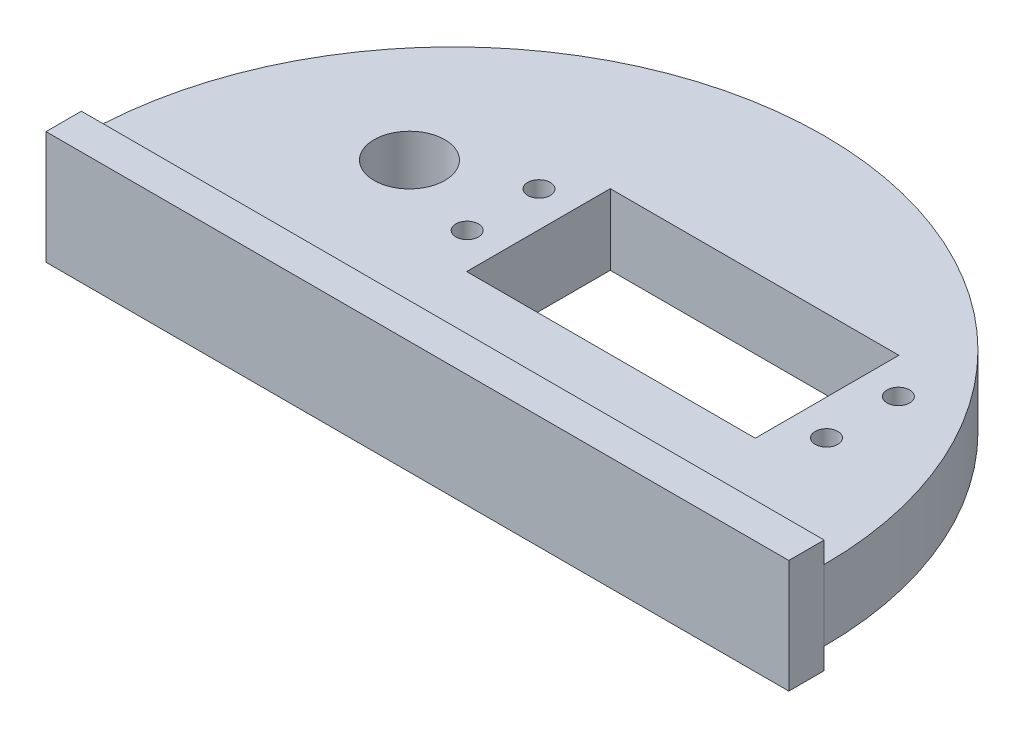
ISO-10303-21;
HEADER;
FILE_DESCRIPTION(('STEP AP214'),'2;1');
FILE_NAME('part.step','',(''),(''),'','','');
FILE_SCHEMA(('AUTOMOTIVE_DESIGN { 1 0 10303 214 1 1 1 1 }'));
ENDSEC;
DATA;
#1=APPLICATION_CONTEXT('core data for automotive mechanical design processes');
#2=APPLICATION_PROTOCOL_DEFINITION('international standard','automotive_design',2000,#1);
#3=PRODUCT_CONTEXT('',#1,'mechanical');
#4=PRODUCT('Part','Part','',(#3));
#5=PRODUCT_RELATED_PRODUCT_CATEGORY('part','',(#4));
#6=PRODUCT_DEFINITION_FORMATION('','',#4);
#7=PRODUCT_DEFINITION_CONTEXT('part definition',#1,'design');
#8=PRODUCT_DEFINITION('design','',#6,#7);
#9=PRODUCT_DEFINITION_SHAPE('','',#8);
#10=(LENGTH_UNIT() NAMED_UNIT(*) SI_UNIT(.MILLI.,.METRE.));
#11=(NAMED_UNIT(*) PLANE_ANGLE_UNIT() SI_UNIT($,.RADIAN.));
#12=(NAMED_UNIT(*) SI_UNIT($,.STERADIAN.) SOLID_ANGLE_UNIT());
#13=UNCERTAINTY_MEASURE_WITH_UNIT(LENGTH_MEASURE(1.E-05),#10,'distance_accuracy_value','');
#14=(GEOMETRIC_REPRESENTATION_CONTEXT(3) GLOBAL_UNCERTAINTY_ASSIGNED_CONTEXT((#13)) GLOBAL_UNIT_ASSIGNED_CONTEXT((#10,
#11,#12)) REPRESENTATION_CONTEXT('',''));
#15=CARTESIAN_POINT('',(0.,0.,0.));
#16=DIRECTION('',(0.,0.,1.));
#17=DIRECTION('',(1.,0.,0.));
#18=AXIS2_PLACEMENT_3D('',#15,#16,#17);
#19=CARTESIAN_POINT('',(-7.72270806151467,-110.,23.6218532774956));
#20=DIRECTION('',(0.,-1.,0.));
#21=DIRECTION('',(1.,0.,0.));
#22=AXIS2_PLACEMENT_3D('',#19,#20,#21);
#23=PLANE('',#22);
#24=CARTESIAN_POINT('',(29.44227348198,-110.,7.95002527249206));
#25=DIRECTION('',(0.,-1.,0.));
#26=DIRECTION('',(1.,0.,0.));
#27=AXIS2_PLACEMENT_3D('',#24,#25,#26);
#28=CIRCLE('',#27,1.6);
#29=CARTESIAN_POINT('',(31.04227348198,-110.,7.95002527249206));
#30=VERTEX_POINT('',#29);
#31=EDGE_CURVE('E142',#30,#30,#28,.T.);
#32=ORIENTED_EDGE('',*,*,#31,.F.);
#33=EDGE_LOOP('',(#32));
#34=FACE_BOUND('',#33,.T.);
#35=CARTESIAN_POINT('',(-21.35772651802,-110.,7.95002527249204));
#36=DIRECTION('',(0.,-1.,0.));
#37=DIRECTION('',(1.,0.,0.));
#38=AXIS2_PLACEMENT_3D('',#35,#36,#37);
#39=CIRCLE('',#38,1.6);
#40=CARTESIAN_POINT('',(-19.75772651802,-110.,7.95002527249204));
#41=VERTEX_POINT('',#40);
#42=EDGE_CURVE('E154',#41,#41,#39,.T.);
#43=ORIENTED_EDGE('',*,*,#42,.F.);
#44=EDGE_LOOP('',(#43));
#45=FACE_BOUND('',#44,.T.);
#46=CARTESIAN_POINT('',(-7.72270806151467,-110.,23.6218532774956));
#47=DIRECTION('',(0.,-1.,0.));
#48=DIRECTION('',(1.,0.,0.));
#49=AXIS2_PLACEMENT_3D('',#46,#47,#48);
#50=CIRCLE('',#49,52.5);
#51=CARTESIAN_POINT('',(-60.2227080615147,-110.,23.6218532774956));
#52=VERTEX_POINT('',#51);
#53=CARTESIAN_POINT('',(44.7772919384853,-110.,23.6218532774956));
#54=VERTEX_POINT('',#53);
#55=EDGE_CURVE('E198',#52,#54,#50,.T.);
#56=ORIENTED_EDGE('',*,*,#55,.T.);
#57=DIRECTION('',(-1.,0.,0.));
#58=VECTOR('',#57,1.);
#59=CARTESIAN_POINT('',(-60.2227080615147,-110.,23.6218532774956));
#60=LINE('',#59,#58);
#61=EDGE_CURVE('E201',#54,#52,#60,.T.);
#62=ORIENTED_EDGE('',*,*,#61,.T.);
#63=EDGE_LOOP('',(#56,#62));
#64=FACE_BOUND('',#63,.T.);
#65=CARTESIAN_POINT('',(-34.0473526112777,-110.,3.41806180830131));
#66=DIRECTION('',(0.,-1.,0.));
#67=DIRECTION('',(1.,0.,0.));
#68=AXIS2_PLACEMENT_3D('',#65,#66,#67);
#69=CIRCLE('',#68,5.);
#70=CARTESIAN_POINT('',(-29.0473526112777,-110.,3.41806180830131));
#71=VERTEX_POINT('',#70);
#72=EDGE_CURVE('E192',#71,#71,#69,.T.);
#73=ORIENTED_EDGE('',*,*,#72,.F.);
#74=EDGE_LOOP('',(#73));
#75=FACE_BOUND('',#74,.T.);
#76=DIRECTION('',(1.,0.,0.));
#77=VECTOR('',#76,1.);
#78=CARTESIAN_POINT('',(-16.35772651802,-110.,-7.27497472750796));
#79=LINE('',#78,#77);
#80=CARTESIAN_POINT('',(-16.35772651802,-110.,-7.27497472750796));
#81=VERTEX_POINT('',#80);
#82=CARTESIAN_POINT('',(24.44227348198,-110.,-7.27497472750796));
#83=VERTEX_POINT('',#82);
#84=EDGE_CURVE('E163',#81,#83,#79,.T.);
#85=ORIENTED_EDGE('',*,*,#84,.F.);
#86=DIRECTION('',(0.,0.,-1.));
#87=VECTOR('',#86,1.);
#88=CARTESIAN_POINT('',(-16.35772651802,-110.,13.025025272492));
#89=LINE('',#88,#87);
#90=CARTESIAN_POINT('',(-16.35772651802,-110.,13.025025272492));
#91=VERTEX_POINT('',#90);
#92=EDGE_CURVE('E160',#91,#81,#89,.T.);
#93=ORIENTED_EDGE('',*,*,#92,.F.);
#94=DIRECTION('',(-1.,0.,0.));
#95=VECTOR('',#94,1.);
#96=CARTESIAN_POINT('',(-16.35772651802,-110.,13.025025272492));
#97=LINE('',#96,#95);
#98=CARTESIAN_POINT('',(24.44227348198,-110.,13.025025272492));
#99=VERTEX_POINT('',#98);
#100=EDGE_CURVE('E169',#99,#91,#97,.T.);
#101=ORIENTED_EDGE('',*,*,#100,.F.);
#102=DIRECTION('',(0.,0.,1.));
#103=VECTOR('',#102,1.);
#104=CARTESIAN_POINT('',(24.44227348198,-110.,13.025025272492));
#105=LINE('',#104,#103);
#106=EDGE_CURVE('E167',#83,#99,#105,.T.);
#107=ORIENTED_EDGE('',*,*,#106,.F.);
#108=EDGE_LOOP('',(#85,#93,#101,#107));
#109=FACE_BOUND('',#108,.T.);
#110=CARTESIAN_POINT('',(-21.35772651802,-110.,-2.19997472750796));
#111=DIRECTION('',(0.,-1.,0.));
#112=DIRECTION('',(1.,0.,0.));
#113=AXIS2_PLACEMENT_3D('',#110,#111,#112);
#114=CIRCLE('',#113,1.6);
#115=CARTESIAN_POINT('',(-19.75772651802,-110.,-2.19997472750796));
#116=VERTEX_POINT('',#115);
#117=EDGE_CURVE('E148',#116,#116,#114,.T.);
#118=ORIENTED_EDGE('',*,*,#117,.F.);
#119=EDGE_LOOP('',(#118));
#120=FACE_BOUND('',#119,.T.);
#121=CARTESIAN_POINT('',(29.44227348198,-110.,-2.19997472750798));
#122=DIRECTION('',(0.,-1.,0.));
#123=DIRECTION('',(1.,0.,0.));
#124=AXIS2_PLACEMENT_3D('',#121,#122,#123);
#125=CIRCLE('',#124,1.60000000000002);
#126=CARTESIAN_POINT('',(31.04227348198,-110.,-2.19997472750798));
#127=VERTEX_POINT('',#126);
#128=EDGE_CURVE('E134',#127,#127,#125,.T.);
#129=ORIENTED_EDGE('',*,*,#128,.F.);
#130=EDGE_LOOP('',(#129));
#131=FACE_BOUND('',#130,.T.);
#132=ADVANCED_FACE('F36',(#34,#45,#64,#75,#109,#120,#131),#23,.T.);
#133=CARTESIAN_POINT('',(-7.72270806151467,-100.,23.6218532774956));
#134=DIRECTION('',(0.,-1.,0.));
#135=DIRECTION('',(1.,0.,0.));
#136=AXIS2_PLACEMENT_3D('',#133,#134,#135);
#137=PLANE('',#136);
#138=CARTESIAN_POINT('',(-34.0473526112777,-100.,3.41806180830131));
#139=DIRECTION('',(0.,-1.,0.));
#140=DIRECTION('',(1.,0.,0.));
#141=AXIS2_PLACEMENT_3D('',#138,#139,#140);
#142=CIRCLE('',#141,5.);
#143=CARTESIAN_POINT('',(-29.0473526112777,-100.,3.41806180830131));
#144=VERTEX_POINT('',#143);
#145=EDGE_CURVE('E191',#144,#144,#142,.T.);
#146=ORIENTED_EDGE('',*,*,#145,.T.);
#147=EDGE_LOOP('',(#146));
#148=FACE_BOUND('',#147,.T.);
#149=CARTESIAN_POINT('',(-7.72270806151467,-100.,23.6218532774956));
#150=DIRECTION('',(0.,-1.,0.));
#151=DIRECTION('',(1.,0.,0.));
#152=AXIS2_PLACEMENT_3D('',#149,#150,#151);
#153=CIRCLE('',#152,52.5);
#154=CARTESIAN_POINT('',(-60.2227080615147,-100.,23.6218532774956));
#155=VERTEX_POINT('',#154);
#156=CARTESIAN_POINT('',(44.7772919384853,-100.,23.6218532774956));
#157=VERTEX_POINT('',#156);
#158=EDGE_CURVE('E195',#155,#157,#153,.T.);
#159=ORIENTED_EDGE('',*,*,#158,.F.);
#160=DIRECTION('',(-1.,0.,0.));
#161=VECTOR('',#160,1.);
#162=CARTESIAN_POINT('',(-60.2227080615147,-100.,23.6218532774956));
#163=LINE('',#162,#161);
#164=EDGE_CURVE('E202',#157,#155,#163,.T.);
#165=ORIENTED_EDGE('',*,*,#164,.F.);
#166=EDGE_LOOP('',(#159,#165));
#167=FACE_BOUND('',#166,.T.);
#168=DIRECTION('',(0.,0.,-1.));
#169=VECTOR('',#168,1.);
#170=CARTESIAN_POINT('',(-16.35772651802,-100.,13.025025272492));
#171=LINE('',#170,#169);
#172=CARTESIAN_POINT('',(-16.35772651802,-100.,13.025025272492));
#173=VERTEX_POINT('',#172);
#174=CARTESIAN_POINT('',(-16.35772651802,-100.,-7.27497472750796));
#175=VERTEX_POINT('',#174);
#176=EDGE_CURVE('E157',#173,#175,#171,.T.);
#177=ORIENTED_EDGE('',*,*,#176,.T.);
#178=DIRECTION('',(1.,0.,0.));
#179=VECTOR('',#178,1.);
#180=CARTESIAN_POINT('',(-16.35772651802,-100.,-7.27497472750796));
#181=LINE('',#180,#179);
#182=CARTESIAN_POINT('',(24.44227348198,-100.,-7.27497472750796));
#183=VERTEX_POINT('',#182);
#184=EDGE_CURVE('E174',#175,#183,#181,.T.);
#185=ORIENTED_EDGE('',*,*,#184,.T.);
#186=DIRECTION('',(0.,0.,1.));
#187=VECTOR('',#186,1.);
#188=CARTESIAN_POINT('',(24.44227348198,-100.,13.025025272492));
#189=LINE('',#188,#187);
#190=CARTESIAN_POINT('',(24.44227348198,-100.,13.025025272492));
#191=VERTEX_POINT('',#190);
#192=EDGE_CURVE('E177',#183,#191,#189,.T.);
#193=ORIENTED_EDGE('',*,*,#192,.T.);
#194=DIRECTION('',(-1.,0.,0.));
#195=VECTOR('',#194,1.);
#196=CARTESIAN_POINT('',(-16.35772651802,-100.,13.025025272492));
#197=LINE('',#196,#195);
#198=EDGE_CURVE('E164',#191,#173,#197,.T.);
#199=ORIENTED_EDGE('',*,*,#198,.T.);
#200=EDGE_LOOP('',(#177,#185,#193,#199));
#201=FACE_BOUND('',#200,.T.);
#202=CARTESIAN_POINT('',(-21.35772651802,-100.,7.95002527249204));
#203=DIRECTION('',(0.,-1.,0.));
#204=DIRECTION('',(1.,0.,0.));
#205=AXIS2_PLACEMENT_3D('',#202,#203,#204);
#206=CIRCLE('',#205,1.6);
#207=CARTESIAN_POINT('',(-19.75772651802,-100.,7.95002527249204));
#208=VERTEX_POINT('',#207);
#209=EDGE_CURVE('E151',#208,#208,#206,.T.);
#210=ORIENTED_EDGE('',*,*,#209,.T.);
#211=EDGE_LOOP('',(#210));
#212=FACE_BOUND('',#211,.T.);
#213=CARTESIAN_POINT('',(-21.35772651802,-100.,-2.19997472750796));
#214=DIRECTION('',(0.,-1.,0.));
#215=DIRECTION('',(1.,0.,0.));
#216=AXIS2_PLACEMENT_3D('',#213,#214,#215);
#217=CIRCLE('',#216,1.6);
#218=CARTESIAN_POINT('',(-19.75772651802,-100.,-2.19997472750796));
#219=VERTEX_POINT('',#218);
#220=EDGE_CURVE('E145',#219,#219,#217,.T.);
#221=ORIENTED_EDGE('',*,*,#220,.T.);
#222=EDGE_LOOP('',(#221));
#223=FACE_BOUND('',#222,.T.);
#224=CARTESIAN_POINT('',(29.44227348198,-100.,7.95002527249206));
#225=DIRECTION('',(0.,-1.,0.));
#226=DIRECTION('',(1.,0.,0.));
#227=AXIS2_PLACEMENT_3D('',#224,#225,#226);
#228=CIRCLE('',#227,1.6);
#229=CARTESIAN_POINT('',(31.04227348198,-100.,7.95002527249206));
#230=VERTEX_POINT('',#229);
#231=EDGE_CURVE('E139',#230,#230,#228,.T.);
#232=ORIENTED_EDGE('',*,*,#231,.T.);
#233=EDGE_LOOP('',(#232));
#234=FACE_BOUND('',#233,.T.);
#235=CARTESIAN_POINT('',(29.44227348198,-100.,-2.19997472750798));
#236=DIRECTION('',(0.,-1.,0.));
#237=DIRECTION('',(1.,0.,0.));
#238=AXIS2_PLACEMENT_3D('',#235,#236,#237);
#239=CIRCLE('',#238,1.60000000000002);
#240=CARTESIAN_POINT('',(31.04227348198,-100.,-2.19997472750798));
#241=VERTEX_POINT('',#240);
#242=EDGE_CURVE('E131',#241,#241,#239,.T.);
#243=ORIENTED_EDGE('',*,*,#242,.T.);
#244=EDGE_LOOP('',(#243));
#245=FACE_BOUND('',#244,.T.);
#246=ADVANCED_FACE('F232',(#148,#167,#201,#212,#223,#234,#245),#137,.F.);
#247=CARTESIAN_POINT('',(-7.72270806151467,-110.,23.6218532774956));
#248=DIRECTION('',(0.,1.,0.));
#249=DIRECTION('',(-1.,0.,0.));
#250=AXIS2_PLACEMENT_3D('',#247,#248,#249);
#251=CYLINDRICAL_SURFACE('',#250,52.5);
#252=ORIENTED_EDGE('',*,*,#158,.T.);
#253=DIRECTION('',(0.,1.,0.));
#254=VECTOR('',#253,1.);
#255=CARTESIAN_POINT('',(44.7772919384853,-110.,23.6218532774956));
#256=LINE('',#255,#254);
#257=EDGE_CURVE('E11',#54,#157,#256,.T.);
#258=ORIENTED_EDGE('',*,*,#257,.F.);
#259=ORIENTED_EDGE('',*,*,#55,.F.);
#260=DIRECTION('',(0.,1.,0.));
#261=VECTOR('',#260,1.);
#262=CARTESIAN_POINT('',(-60.2227080615147,-110.,23.6218532774956));
#263=LINE('',#262,#261);
#264=EDGE_CURVE('E46',#52,#155,#263,.T.);
#265=ORIENTED_EDGE('',*,*,#264,.T.);
#266=EDGE_LOOP('',(#252,#258,#259,#265));
#267=FACE_BOUND('',#266,.T.);
#268=ADVANCED_FACE('F230',(#267),#251,.T.);
#269=CARTESIAN_POINT('',(-34.0473526112777,-110.,3.41806180830131));
#270=DIRECTION('',(0.,1.,0.));
#271=DIRECTION('',(-1.,0.,0.));
#272=AXIS2_PLACEMENT_3D('',#269,#270,#271);
#273=CYLINDRICAL_SURFACE('',#272,5.);
#274=ORIENTED_EDGE('',*,*,#72,.T.);
#275=EDGE_LOOP('',(#274));
#276=FACE_BOUND('',#275,.T.);
#277=ORIENTED_EDGE('',*,*,#145,.F.);
#278=EDGE_LOOP('',(#277));
#279=FACE_BOUND('',#278,.T.);
#280=ADVANCED_FACE('F385',(#276,#279),#273,.F.);
#281=CARTESIAN_POINT('',(-16.35772651802,-110.,13.025025272492));
#282=DIRECTION('',(1.,0.,0.));
#283=DIRECTION('',(0.,1.,0.));
#284=AXIS2_PLACEMENT_3D('',#281,#282,#283);
#285=PLANE('',#284);
#286=ORIENTED_EDGE('',*,*,#176,.F.);
#287=DIRECTION('',(0.,1.,0.));
#288=VECTOR('',#287,1.);
#289=CARTESIAN_POINT('',(-16.35772651802,-110.,13.025025272492));
#290=LINE('',#289,#288);
#291=EDGE_CURVE('E171',#91,#173,#290,.T.);
#292=ORIENTED_EDGE('',*,*,#291,.F.);
#293=ORIENTED_EDGE('',*,*,#92,.T.);
#294=DIRECTION('',(0.,1.,0.));
#295=VECTOR('',#294,1.);
#296=CARTESIAN_POINT('',(-16.35772651802,-110.,-7.27497472750796));
#297=LINE('',#296,#295);
#298=EDGE_CURVE('E188',#81,#175,#297,.T.);
#299=ORIENTED_EDGE('',*,*,#298,.T.);
#300=EDGE_LOOP('',(#286,#292,#293,#299));
#301=FACE_BOUND('',#300,.T.);
#302=ADVANCED_FACE('F251',(#301),#285,.T.);
#303=CARTESIAN_POINT('',(-16.35772651802,-110.,-7.27497472750796));
#304=DIRECTION('',(0.,0.,1.));
#305=DIRECTION('',(-1.,0.,0.));
#306=AXIS2_PLACEMENT_3D('',#303,#304,#305);
#307=PLANE('',#306);
#308=ORIENTED_EDGE('',*,*,#184,.F.);
#309=ORIENTED_EDGE('',*,*,#298,.F.);
#310=ORIENTED_EDGE('',*,*,#84,.T.);
#311=DIRECTION('',(0.,1.,0.));
#312=VECTOR('',#311,1.);
#313=CARTESIAN_POINT('',(24.44227348198,-110.,-7.27497472750796));
#314=LINE('',#313,#312);
#315=EDGE_CURVE('E185',#83,#183,#314,.T.);
#316=ORIENTED_EDGE('',*,*,#315,.T.);
#317=EDGE_LOOP('',(#308,#309,#310,#316));
#318=FACE_BOUND('',#317,.T.);
#319=ADVANCED_FACE('F256',(#318),#307,.T.);
#320=CARTESIAN_POINT('',(24.44227348198,-110.,13.025025272492));
#321=DIRECTION('',(-1.,0.,0.));
#322=DIRECTION('',(0.,-1.,0.));
#323=AXIS2_PLACEMENT_3D('',#320,#321,#322);
#324=PLANE('',#323);
#325=ORIENTED_EDGE('',*,*,#192,.F.);
#326=ORIENTED_EDGE('',*,*,#315,.F.);
#327=ORIENTED_EDGE('',*,*,#106,.T.);
#328=DIRECTION('',(0.,1.,0.));
#329=VECTOR('',#328,1.);
#330=CARTESIAN_POINT('',(24.44227348198,-110.,13.025025272492));
#331=LINE('',#330,#329);
#332=EDGE_CURVE('E55',#99,#191,#331,.T.);
#333=ORIENTED_EDGE('',*,*,#332,.T.);
#334=EDGE_LOOP('',(#325,#326,#327,#333));
#335=FACE_BOUND('',#334,.T.);
#336=ADVANCED_FACE('F262',(#335),#324,.T.);
#337=CARTESIAN_POINT('',(-16.35772651802,-110.,13.025025272492));
#338=DIRECTION('',(0.,0.,-1.));
#339=DIRECTION('',(1.,0.,0.));
#340=AXIS2_PLACEMENT_3D('',#337,#338,#339);
#341=PLANE('',#340);
#342=ORIENTED_EDGE('',*,*,#198,.F.);
#343=ORIENTED_EDGE('',*,*,#332,.F.);
#344=ORIENTED_EDGE('',*,*,#100,.T.);
#345=ORIENTED_EDGE('',*,*,#291,.T.);
#346=EDGE_LOOP('',(#342,#343,#344,#345));
#347=FACE_BOUND('',#346,.T.);
#348=ADVANCED_FACE('F264',(#347),#341,.T.);
#349=CARTESIAN_POINT('',(-21.35772651802,-110.,7.95002527249204));
#350=DIRECTION('',(0.,1.,0.));
#351=DIRECTION('',(-1.,0.,0.));
#352=AXIS2_PLACEMENT_3D('',#349,#350,#351);
#353=CYLINDRICAL_SURFACE('',#352,1.6);
#354=ORIENTED_EDGE('',*,*,#42,.T.);
#355=EDGE_LOOP('',(#354));
#356=FACE_BOUND('',#355,.T.);
#357=ORIENTED_EDGE('',*,*,#209,.F.);
#358=EDGE_LOOP('',(#357));
#359=FACE_BOUND('',#358,.T.);
#360=ADVANCED_FACE('F266',(#356,#359),#353,.F.);
#361=CARTESIAN_POINT('',(-21.35772651802,-110.,-2.19997472750796));
#362=DIRECTION('',(0.,1.,0.));
#363=DIRECTION('',(-1.,0.,0.));
#364=AXIS2_PLACEMENT_3D('',#361,#362,#363);
#365=CYLINDRICAL_SURFACE('',#364,1.6);
#366=ORIENTED_EDGE('',*,*,#117,.T.);
#367=EDGE_LOOP('',(#366));
#368=FACE_BOUND('',#367,.T.);
#369=ORIENTED_EDGE('',*,*,#220,.F.);
#370=EDGE_LOOP('',(#369));
#371=FACE_BOUND('',#370,.T.);
#372=ADVANCED_FACE('F272',(#368,#371),#365,.F.);
#373=CARTESIAN_POINT('',(29.44227348198,-110.,7.95002527249206));
#374=DIRECTION('',(0.,1.,0.));
#375=DIRECTION('',(-1.,0.,0.));
#376=AXIS2_PLACEMENT_3D('',#373,#374,#375);
#377=CYLINDRICAL_SURFACE('',#376,1.6);
#378=ORIENTED_EDGE('',*,*,#31,.T.);
#379=EDGE_LOOP('',(#378));
#380=FACE_BOUND('',#379,.T.);
#381=ORIENTED_EDGE('',*,*,#231,.F.);
#382=EDGE_LOOP('',(#381));
#383=FACE_BOUND('',#382,.T.);
#384=ADVANCED_FACE('F333',(#380,#383),#377,.F.);
#385=CARTESIAN_POINT('',(29.44227348198,-110.,-2.19997472750798));
#386=DIRECTION('',(0.,1.,0.));
#387=DIRECTION('',(-1.,0.,0.));
#388=AXIS2_PLACEMENT_3D('',#385,#386,#387);
#389=CYLINDRICAL_SURFACE('',#388,1.60000000000002);
#390=ORIENTED_EDGE('',*,*,#128,.T.);
#391=EDGE_LOOP('',(#390));
#392=FACE_BOUND('',#391,.T.);
#393=ORIENTED_EDGE('',*,*,#242,.F.);
#394=EDGE_LOOP('',(#393));
#395=FACE_BOUND('',#394,.T.);
#396=ADVANCED_FACE('F289',(#392,#395),#389,.F.);
#397=CARTESIAN_POINT('',(44.7772919384853,-113.,28.6218532774956));
#398=DIRECTION('',(0.,1.,0.));
#399=DIRECTION('',(-1.,0.,0.));
#400=AXIS2_PLACEMENT_3D('',#397,#398,#399);
#401=PLANE('',#400);
#402=DIRECTION('',(1.,0.,0.));
#403=VECTOR('',#402,1.);
#404=CARTESIAN_POINT('',(44.7772919384853,-113.,23.6218532774956));
#405=LINE('',#404,#403);
#406=CARTESIAN_POINT('',(-60.2227080615147,-113.,23.6218532774956));
#407=VERTEX_POINT('',#406);
#408=CARTESIAN_POINT('',(44.7772919384853,-113.,23.6218532774956));
#409=VERTEX_POINT('',#408);
#410=EDGE_CURVE('E86',#407,#409,#405,.T.);
#411=ORIENTED_EDGE('',*,*,#410,.T.);
#412=DIRECTION('',(0.,0.,-1.));
#413=VECTOR('',#412,1.);
#414=CARTESIAN_POINT('',(44.7772919384853,-113.,28.6218532774956));
#415=LINE('',#414,#413);
#416=CARTESIAN_POINT('',(44.7772919384853,-113.,28.6218532774956));
#417=VERTEX_POINT('',#416);
#418=EDGE_CURVE('E114',#417,#409,#415,.T.);
#419=ORIENTED_EDGE('',*,*,#418,.F.);
#420=DIRECTION('',(1.,0.,0.));
#421=VECTOR('',#420,1.);
#422=CARTESIAN_POINT('',(44.7772919384853,-113.,28.6218532774956));
#423=LINE('',#422,#421);
#424=CARTESIAN_POINT('',(-60.2227080615147,-113.,28.6218532774956));
#425=VERTEX_POINT('',#424);
#426=EDGE_CURVE('E211',#425,#417,#423,.T.);
#427=ORIENTED_EDGE('',*,*,#426,.F.);
#428=DIRECTION('',(0.,0.,-1.));
#429=VECTOR('',#428,1.);
#430=CARTESIAN_POINT('',(-60.2227080615147,-113.,28.6218532774956));
#431=LINE('',#430,#429);
#432=EDGE_CURVE('E128',#425,#407,#431,.T.);
#433=ORIENTED_EDGE('',*,*,#432,.T.);
#434=EDGE_LOOP('',(#411,#419,#427,#433));
#435=FACE_BOUND('',#434,.T.);
#436=ADVANCED_FACE('F287',(#435),#401,.F.);
#437=CARTESIAN_POINT('',(-60.2227080615147,-100.,28.6218532774956));
#438=DIRECTION('',(0.,0.,-1.));
#439=DIRECTION('',(-1.,0.,0.));
#440=AXIS2_PLACEMENT_3D('',#437,#438,#439);
#441=PLANE('',#440);
#442=DIRECTION('',(-1.,0.,0.));
#443=VECTOR('',#442,1.);
#444=CARTESIAN_POINT('',(44.7772919384853,-97.,28.6218532774956));
#445=LINE('',#444,#443);
#446=CARTESIAN_POINT('',(44.7772919384853,-97.,28.6218532774956));
#447=VERTEX_POINT('',#446);
#448=CARTESIAN_POINT('',(-60.2227080615147,-97.,28.6218532774956));
#449=VERTEX_POINT('',#448);
#450=EDGE_CURVE('E113',#447,#449,#445,.T.);
#451=ORIENTED_EDGE('',*,*,#450,.T.);
#452=DIRECTION('',(0.,-1.,0.));
#453=VECTOR('',#452,1.);
#454=CARTESIAN_POINT('',(-60.2227080615147,-113.,28.6218532774956));
#455=LINE('',#454,#453);
#456=EDGE_CURVE('E210',#449,#425,#455,.T.);
#457=ORIENTED_EDGE('',*,*,#456,.T.);
#458=ORIENTED_EDGE('',*,*,#426,.T.);
#459=DIRECTION('',(0.,1.,0.));
#460=VECTOR('',#459,1.);
#461=CARTESIAN_POINT('',(44.7772919384853,-97.,28.6218532774956));
#462=LINE('',#461,#460);
#463=EDGE_CURVE('E115',#417,#447,#462,.T.);
#464=ORIENTED_EDGE('',*,*,#463,.T.);
#465=EDGE_LOOP('',(#451,#457,#458,#464));
#466=FACE_BOUND('',#465,.T.);
#467=ADVANCED_FACE('F213',(#466),#441,.F.);
#468=CARTESIAN_POINT('',(44.7772919384853,-97.,28.6218532774956));
#469=DIRECTION('',(0.,-1.,0.));
#470=DIRECTION('',(1.,0.,0.));
#471=AXIS2_PLACEMENT_3D('',#468,#469,#470);
#472=PLANE('',#471);
#473=DIRECTION('',(-1.,0.,0.));
#474=VECTOR('',#473,1.);
#475=CARTESIAN_POINT('',(44.7772919384853,-97.,23.6218532774956));
#476=LINE('',#475,#474);
#477=CARTESIAN_POINT('',(44.7772919384853,-97.,23.6218532774956));
#478=VERTEX_POINT('',#477);
#479=CARTESIAN_POINT('',(-60.2227080615147,-97.,23.6218532774956));
#480=VERTEX_POINT('',#479);
#481=EDGE_CURVE('E111',#478,#480,#476,.T.);
#482=ORIENTED_EDGE('',*,*,#481,.T.);
#483=DIRECTION('',(0.,0.,-1.));
#484=VECTOR('',#483,1.);
#485=CARTESIAN_POINT('',(-60.2227080615147,-97.,28.6218532774956));
#486=LINE('',#485,#484);
#487=EDGE_CURVE('E40',#449,#480,#486,.T.);
#488=ORIENTED_EDGE('',*,*,#487,.F.);
#489=ORIENTED_EDGE('',*,*,#450,.F.);
#490=DIRECTION('',(0.,0.,-1.));
#491=VECTOR('',#490,1.);
#492=CARTESIAN_POINT('',(44.7772919384853,-97.,28.6218532774956));
#493=LINE('',#492,#491);
#494=EDGE_CURVE('E97',#447,#478,#493,.T.);
#495=ORIENTED_EDGE('',*,*,#494,.T.);
#496=EDGE_LOOP('',(#482,#488,#489,#495));
#497=FACE_BOUND('',#496,.T.);
#498=ADVANCED_FACE('F38',(#497),#472,.F.);
#499=CARTESIAN_POINT('',(-60.2227080615147,-100.,23.6218532774956));
#500=DIRECTION('',(0.,0.,-1.));
#501=DIRECTION('',(-1.,0.,0.));
#502=AXIS2_PLACEMENT_3D('',#499,#500,#501);
#503=PLANE('',#502);
#504=ORIENTED_EDGE('',*,*,#164,.T.);
#505=DIRECTION('',(0.,-1.,0.));
#506=VECTOR('',#505,1.);
#507=CARTESIAN_POINT('',(-60.2227080615147,-113.,23.6218532774956));
#508=LINE('',#507,#506);
#509=EDGE_CURVE('E119',#480,#155,#508,.T.);
#510=ORIENTED_EDGE('',*,*,#509,.F.);
#511=ORIENTED_EDGE('',*,*,#481,.F.);
#512=DIRECTION('',(0.,1.,0.));
#513=VECTOR('',#512,1.);
#514=CARTESIAN_POINT('',(44.7772919384853,-97.,23.6218532774956));
#515=LINE('',#514,#513);
#516=EDGE_CURVE('E92',#157,#478,#515,.T.);
#517=ORIENTED_EDGE('',*,*,#516,.F.);
#518=EDGE_LOOP('',(#504,#510,#511,#517));
#519=FACE_BOUND('',#518,.T.);
#520=ADVANCED_FACE('F117',(#519),#503,.T.);
#521=EDGE_CURVE('E121',#52,#407,#508,.T.);
#522=ORIENTED_EDGE('',*,*,#521,.F.);
#523=ORIENTED_EDGE('',*,*,#61,.F.);
#524=EDGE_CURVE('E106',#409,#54,#515,.T.);
#525=ORIENTED_EDGE('',*,*,#524,.F.);
#526=ORIENTED_EDGE('',*,*,#410,.F.);
#527=EDGE_LOOP('',(#522,#523,#525,#526));
#528=FACE_BOUND('',#527,.T.);
#529=ADVANCED_FACE('F219',(#528),#503,.T.);
#530=CARTESIAN_POINT('',(44.7772919384853,-97.,28.6218532774956));
#531=DIRECTION('',(-1.,0.,0.));
#532=DIRECTION('',(0.,0.,1.));
#533=AXIS2_PLACEMENT_3D('',#530,#531,#532);
#534=PLANE('',#533);
#535=ORIENTED_EDGE('',*,*,#524,.T.);
#536=ORIENTED_EDGE('',*,*,#257,.T.);
#537=ORIENTED_EDGE('',*,*,#516,.T.);
#538=ORIENTED_EDGE('',*,*,#494,.F.);
#539=ORIENTED_EDGE('',*,*,#463,.F.);
#540=ORIENTED_EDGE('',*,*,#418,.T.);
#541=EDGE_LOOP('',(#535,#536,#537,#538,#539,#540));
#542=FACE_BOUND('',#541,.T.);
#543=ADVANCED_FACE('F95',(#542),#534,.F.);
#544=CARTESIAN_POINT('',(-60.2227080615147,-113.,28.6218532774956));
#545=DIRECTION('',(1.,0.,0.));
#546=DIRECTION('',(0.,0.,-1.));
#547=AXIS2_PLACEMENT_3D('',#544,#545,#546);
#548=PLANE('',#547);
#549=ORIENTED_EDGE('',*,*,#509,.T.);
#550=ORIENTED_EDGE('',*,*,#264,.F.);
#551=ORIENTED_EDGE('',*,*,#521,.T.);
#552=ORIENTED_EDGE('',*,*,#432,.F.);
#553=ORIENTED_EDGE('',*,*,#456,.F.);
#554=ORIENTED_EDGE('',*,*,#487,.T.);
#555=EDGE_LOOP('',(#549,#550,#551,#552,#553,#554));
#556=FACE_BOUND('',#555,.T.);
#557=ADVANCED_FACE('F227',(#556),#548,.F.);
#558=CLOSED_SHELL('',(#132,#246,#268,#280,#302,#319,#336,#348,#360,#372,#384,#396,#436,#467,
#498,#520,#529,#543,#557));
#559=MANIFOLD_SOLID_BREP('B2',#558);
#560=ADVANCED_BREP_SHAPE_REPRESENTATION('',(#18,#559),#14);
#561=SHAPE_DEFINITION_REPRESENTATION(#9,#560);
ENDSEC;
END-ISO-10303-21;
